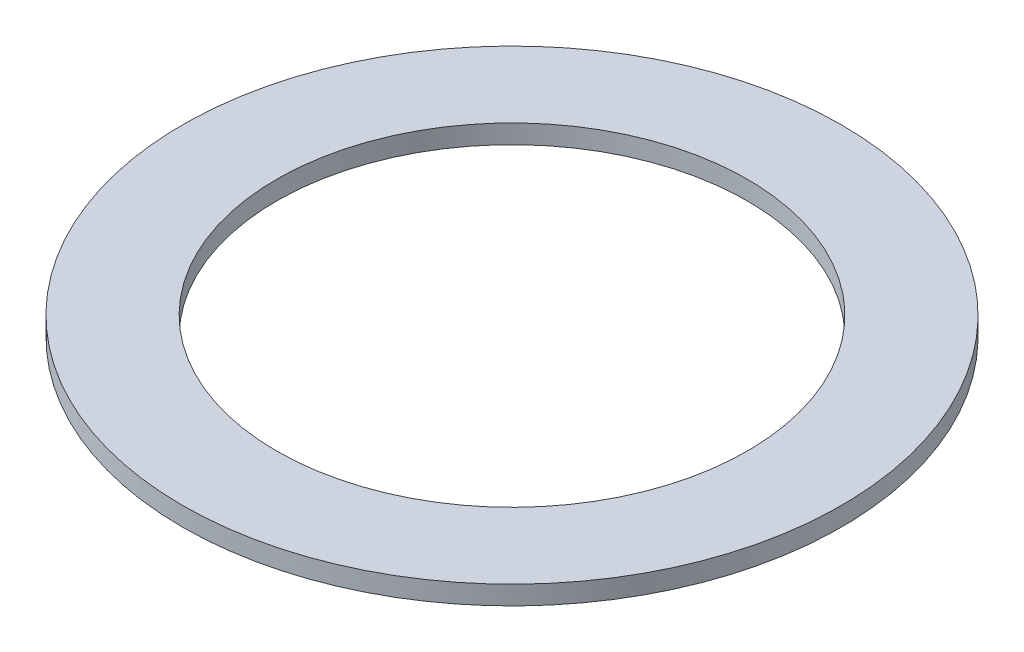
ISO-10303-21;
HEADER;
FILE_DESCRIPTION(('STEP AP214'),'2;1');
FILE_NAME('part.step','',(''),(''),'','','');
FILE_SCHEMA(('AUTOMOTIVE_DESIGN { 1 0 10303 214 1 1 1 1 }'));
ENDSEC;
DATA;
#1=APPLICATION_CONTEXT('core data for automotive mechanical design processes');
#2=APPLICATION_PROTOCOL_DEFINITION('international standard','automotive_design',2000,#1);
#3=PRODUCT_CONTEXT('',#1,'mechanical');
#4=PRODUCT('Part','Part','',(#3));
#5=PRODUCT_RELATED_PRODUCT_CATEGORY('part','',(#4));
#6=PRODUCT_DEFINITION_FORMATION('','',#4);
#7=PRODUCT_DEFINITION_CONTEXT('part definition',#1,'design');
#8=PRODUCT_DEFINITION('design','',#6,#7);
#9=PRODUCT_DEFINITION_SHAPE('','',#8);
#10=(LENGTH_UNIT() NAMED_UNIT(*) SI_UNIT(.MILLI.,.METRE.));
#11=(NAMED_UNIT(*) PLANE_ANGLE_UNIT() SI_UNIT($,.RADIAN.));
#12=(NAMED_UNIT(*) SI_UNIT($,.STERADIAN.) SOLID_ANGLE_UNIT());
#13=UNCERTAINTY_MEASURE_WITH_UNIT(LENGTH_MEASURE(1.E-05),#10,'distance_accuracy_value','');
#14=(GEOMETRIC_REPRESENTATION_CONTEXT(3) GLOBAL_UNCERTAINTY_ASSIGNED_CONTEXT((#13)) GLOBAL_UNIT_ASSIGNED_CONTEXT((#10,
#11,#12)) REPRESENTATION_CONTEXT('',''));
#15=CARTESIAN_POINT('',(0.,0.,0.));
#16=DIRECTION('',(0.,0.,1.));
#17=DIRECTION('',(1.,0.,0.));
#18=AXIS2_PLACEMENT_3D('',#15,#16,#17);
#19=CARTESIAN_POINT('',(0.,1.,0.));
#20=DIRECTION('',(0.,1.,0.));
#21=DIRECTION('',(0.,0.,1.));
#22=AXIS2_PLACEMENT_3D('',#19,#20,#21);
#23=PLANE('',#22);
#24=CARTESIAN_POINT('',(0.,1.,0.));
#25=DIRECTION('',(0.,1.,0.));
#26=DIRECTION('',(0.,0.,1.));
#27=AXIS2_PLACEMENT_3D('',#24,#25,#26);
#28=CIRCLE('',#27,17.5);
#29=CARTESIAN_POINT('',(0.,1.,17.5));
#30=VERTEX_POINT('',#29);
#31=EDGE_CURVE('E12',#30,#30,#28,.T.);
#32=ORIENTED_EDGE('',*,*,#31,.T.);
#33=EDGE_LOOP('',(#32));
#34=FACE_BOUND('',#33,.T.);
#35=CARTESIAN_POINT('',(0.,1.,0.));
#36=DIRECTION('',(0.,1.,0.));
#37=DIRECTION('',(0.,0.,1.));
#38=AXIS2_PLACEMENT_3D('',#35,#36,#37);
#39=CIRCLE('',#38,12.5);
#40=CARTESIAN_POINT('',(0.,1.,12.5));
#41=VERTEX_POINT('',#40);
#42=EDGE_CURVE('E58',#41,#41,#39,.T.);
#43=ORIENTED_EDGE('',*,*,#42,.F.);
#44=EDGE_LOOP('',(#43));
#45=FACE_BOUND('',#44,.T.);
#46=ADVANCED_FACE('F47',(#34,#45),#23,.T.);
#47=CARTESIAN_POINT('',(0.,0.,0.));
#48=DIRECTION('',(0.,1.,0.));
#49=DIRECTION('',(0.,0.,1.));
#50=AXIS2_PLACEMENT_3D('',#47,#48,#49);
#51=PLANE('',#50);
#52=CARTESIAN_POINT('',(0.,0.,0.));
#53=DIRECTION('',(0.,1.,0.));
#54=DIRECTION('',(0.,0.,1.));
#55=AXIS2_PLACEMENT_3D('',#52,#53,#54);
#56=CIRCLE('',#55,17.5);
#57=CARTESIAN_POINT('',(0.,0.,17.5));
#58=VERTEX_POINT('',#57);
#59=EDGE_CURVE('E51',#58,#58,#56,.T.);
#60=ORIENTED_EDGE('',*,*,#59,.F.);
#61=EDGE_LOOP('',(#60));
#62=FACE_BOUND('',#61,.T.);
#63=CARTESIAN_POINT('',(0.,0.,0.));
#64=DIRECTION('',(0.,1.,0.));
#65=DIRECTION('',(0.,0.,1.));
#66=AXIS2_PLACEMENT_3D('',#63,#64,#65);
#67=CIRCLE('',#66,12.5);
#68=CARTESIAN_POINT('',(0.,0.,12.5));
#69=VERTEX_POINT('',#68);
#70=EDGE_CURVE('E60',#69,#69,#67,.T.);
#71=ORIENTED_EDGE('',*,*,#70,.T.);
#72=EDGE_LOOP('',(#71));
#73=FACE_BOUND('',#72,.T.);
#74=ADVANCED_FACE('F70',(#62,#73),#51,.F.);
#75=CARTESIAN_POINT('',(0.,1.,0.));
#76=DIRECTION('',(0.,-1.,0.));
#77=DIRECTION('',(0.,0.,-1.));
#78=AXIS2_PLACEMENT_3D('',#75,#76,#77);
#79=CYLINDRICAL_SURFACE('',#78,17.5);
#80=ORIENTED_EDGE('',*,*,#31,.F.);
#81=EDGE_LOOP('',(#80));
#82=FACE_BOUND('',#81,.T.);
#83=ORIENTED_EDGE('',*,*,#59,.T.);
#84=EDGE_LOOP('',(#83));
#85=FACE_BOUND('',#84,.T.);
#86=ADVANCED_FACE('F49',(#82,#85),#79,.T.);
#87=CARTESIAN_POINT('',(0.,1.,0.));
#88=DIRECTION('',(0.,-1.,0.));
#89=DIRECTION('',(0.,0.,-1.));
#90=AXIS2_PLACEMENT_3D('',#87,#88,#89);
#91=CYLINDRICAL_SURFACE('',#90,12.5);
#92=ORIENTED_EDGE('',*,*,#42,.T.);
#93=EDGE_LOOP('',(#92));
#94=FACE_BOUND('',#93,.T.);
#95=ORIENTED_EDGE('',*,*,#70,.F.);
#96=EDGE_LOOP('',(#95));
#97=FACE_BOUND('',#96,.T.);
#98=ADVANCED_FACE('F66',(#94,#97),#91,.F.);
#99=CLOSED_SHELL('',(#46,#74,#86,#98));
#100=MANIFOLD_SOLID_BREP('B2',#99);
#101=ADVANCED_BREP_SHAPE_REPRESENTATION('',(#18,#100),#14);
#102=SHAPE_DEFINITION_REPRESENTATION(#9,#101);
ENDSEC;
END-ISO-10303-21;
